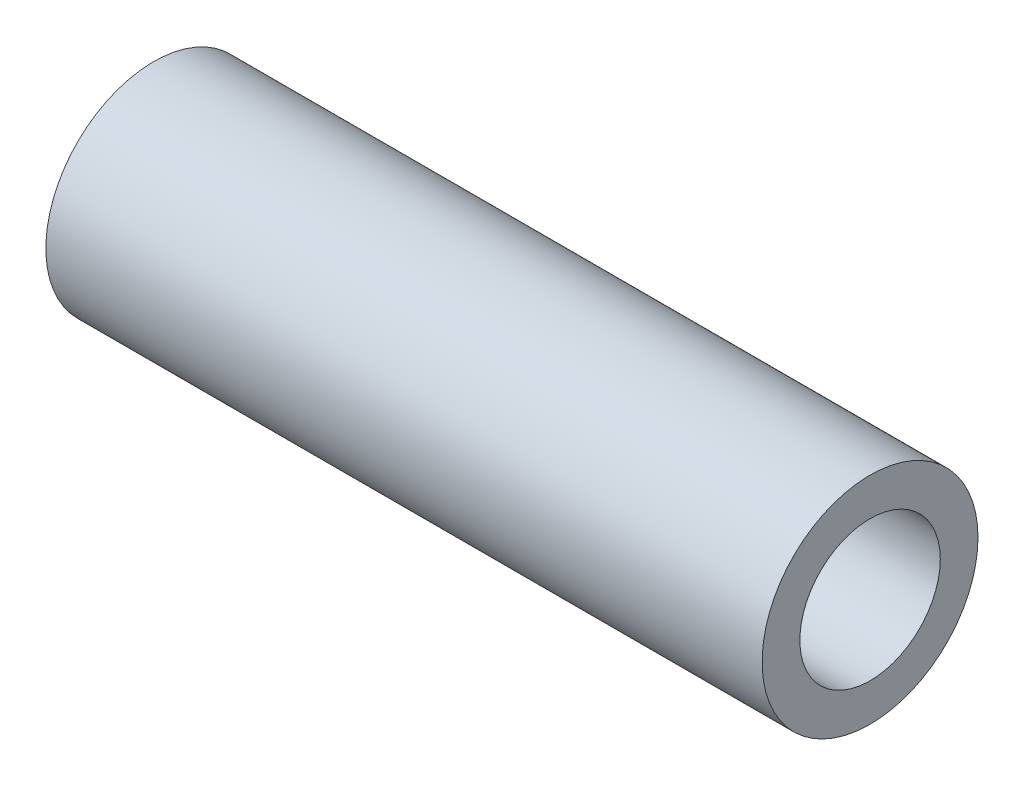
ISO-10303-21;
HEADER;
FILE_DESCRIPTION(('STEP AP214'),'2;1');
FILE_NAME('part.step','',(''),(''),'','','');
FILE_SCHEMA(('AUTOMOTIVE_DESIGN { 1 0 10303 214 1 1 1 1 }'));
ENDSEC;
DATA;
#1=APPLICATION_CONTEXT('core data for automotive mechanical design processes');
#2=APPLICATION_PROTOCOL_DEFINITION('international standard','automotive_design',2000,#1);
#3=PRODUCT_CONTEXT('',#1,'mechanical');
#4=PRODUCT('Part','Part','',(#3));
#5=PRODUCT_RELATED_PRODUCT_CATEGORY('part','',(#4));
#6=PRODUCT_DEFINITION_FORMATION('','',#4);
#7=PRODUCT_DEFINITION_CONTEXT('part definition',#1,'design');
#8=PRODUCT_DEFINITION('design','',#6,#7);
#9=PRODUCT_DEFINITION_SHAPE('','',#8);
#10=(LENGTH_UNIT() NAMED_UNIT(*) SI_UNIT(.MILLI.,.METRE.));
#11=(NAMED_UNIT(*) PLANE_ANGLE_UNIT() SI_UNIT($,.RADIAN.));
#12=(NAMED_UNIT(*) SI_UNIT($,.STERADIAN.) SOLID_ANGLE_UNIT());
#13=UNCERTAINTY_MEASURE_WITH_UNIT(LENGTH_MEASURE(1.E-05),#10,'distance_accuracy_value','');
#14=(GEOMETRIC_REPRESENTATION_CONTEXT(3) GLOBAL_UNCERTAINTY_ASSIGNED_CONTEXT((#13)) GLOBAL_UNIT_ASSIGNED_CONTEXT((#10,
#11,#12)) REPRESENTATION_CONTEXT('',''));
#15=CARTESIAN_POINT('',(0.,0.,0.));
#16=DIRECTION('',(0.,0.,1.));
#17=DIRECTION('',(1.,0.,0.));
#18=AXIS2_PLACEMENT_3D('',#15,#16,#17);
#19=CARTESIAN_POINT('',(6.477,0.,0.));
#20=DIRECTION('',(1.,0.,0.));
#21=DIRECTION('',(0.,0.,-1.));
#22=AXIS2_PLACEMENT_3D('',#19,#20,#21);
#23=PLANE('',#22);
#24=CARTESIAN_POINT('',(6.477,0.,0.));
#25=DIRECTION('',(1.,0.,0.));
#26=DIRECTION('',(0.,0.,-1.));
#27=AXIS2_PLACEMENT_3D('',#24,#25,#26);
#28=CIRCLE('',#27,1.95217796946084);
#29=CARTESIAN_POINT('',(6.477,0.,-1.95217796946084));
#30=VERTEX_POINT('',#29);
#31=EDGE_CURVE('E10',#30,#30,#28,.T.);
#32=ORIENTED_EDGE('',*,*,#31,.T.);
#33=EDGE_LOOP('',(#32));
#34=FACE_BOUND('',#33,.T.);
#35=CARTESIAN_POINT('',(6.477,0.,0.));
#36=DIRECTION('',(1.,0.,0.));
#37=DIRECTION('',(0.,0.,-1.));
#38=AXIS2_PLACEMENT_3D('',#35,#36,#37);
#39=CIRCLE('',#38,1.27);
#40=CARTESIAN_POINT('',(6.477,0.,-1.27));
#41=VERTEX_POINT('',#40);
#42=EDGE_CURVE('E44',#41,#41,#39,.T.);
#43=ORIENTED_EDGE('',*,*,#42,.F.);
#44=EDGE_LOOP('',(#43));
#45=FACE_BOUND('',#44,.T.);
#46=ADVANCED_FACE('F33',(#34,#45),#23,.T.);
#47=CARTESIAN_POINT('',(-6.477,0.,0.));
#48=DIRECTION('',(1.,0.,0.));
#49=DIRECTION('',(0.,0.,-1.));
#50=AXIS2_PLACEMENT_3D('',#47,#48,#49);
#51=PLANE('',#50);
#52=CARTESIAN_POINT('',(-6.477,0.,0.));
#53=DIRECTION('',(1.,0.,0.));
#54=DIRECTION('',(0.,0.,-1.));
#55=AXIS2_PLACEMENT_3D('',#52,#53,#54);
#56=CIRCLE('',#55,1.95217796946084);
#57=CARTESIAN_POINT('',(-6.477,0.,-1.95217796946084));
#58=VERTEX_POINT('',#57);
#59=EDGE_CURVE('E37',#58,#58,#56,.T.);
#60=ORIENTED_EDGE('',*,*,#59,.F.);
#61=EDGE_LOOP('',(#60));
#62=FACE_BOUND('',#61,.T.);
#63=CARTESIAN_POINT('',(-6.477,0.,0.));
#64=DIRECTION('',(1.,0.,0.));
#65=DIRECTION('',(0.,0.,-1.));
#66=AXIS2_PLACEMENT_3D('',#63,#64,#65);
#67=CIRCLE('',#66,1.27);
#68=CARTESIAN_POINT('',(-6.477,0.,-1.27));
#69=VERTEX_POINT('',#68);
#70=EDGE_CURVE('E46',#69,#69,#67,.T.);
#71=ORIENTED_EDGE('',*,*,#70,.T.);
#72=EDGE_LOOP('',(#71));
#73=FACE_BOUND('',#72,.T.);
#74=ADVANCED_FACE('F56',(#62,#73),#51,.F.);
#75=CARTESIAN_POINT('',(6.477,0.,0.));
#76=DIRECTION('',(-1.,0.,0.));
#77=DIRECTION('',(0.,0.,1.));
#78=AXIS2_PLACEMENT_3D('',#75,#76,#77);
#79=CYLINDRICAL_SURFACE('',#78,1.95217796946084);
#80=ORIENTED_EDGE('',*,*,#31,.F.);
#81=EDGE_LOOP('',(#80));
#82=FACE_BOUND('',#81,.T.);
#83=ORIENTED_EDGE('',*,*,#59,.T.);
#84=EDGE_LOOP('',(#83));
#85=FACE_BOUND('',#84,.T.);
#86=ADVANCED_FACE('F35',(#82,#85),#79,.T.);
#87=CARTESIAN_POINT('',(6.477,0.,0.));
#88=DIRECTION('',(-1.,0.,0.));
#89=DIRECTION('',(0.,0.,1.));
#90=AXIS2_PLACEMENT_3D('',#87,#88,#89);
#91=CYLINDRICAL_SURFACE('',#90,1.27);
#92=ORIENTED_EDGE('',*,*,#42,.T.);
#93=EDGE_LOOP('',(#92));
#94=FACE_BOUND('',#93,.T.);
#95=ORIENTED_EDGE('',*,*,#70,.F.);
#96=EDGE_LOOP('',(#95));
#97=FACE_BOUND('',#96,.T.);
#98=ADVANCED_FACE('F52',(#94,#97),#91,.F.);
#99=CLOSED_SHELL('',(#46,#74,#86,#98));
#100=MANIFOLD_SOLID_BREP('B2',#99);
#101=ADVANCED_BREP_SHAPE_REPRESENTATION('',(#18,#100),#14);
#102=SHAPE_DEFINITION_REPRESENTATION(#9,#101);
ENDSEC;
END-ISO-10303-21;
